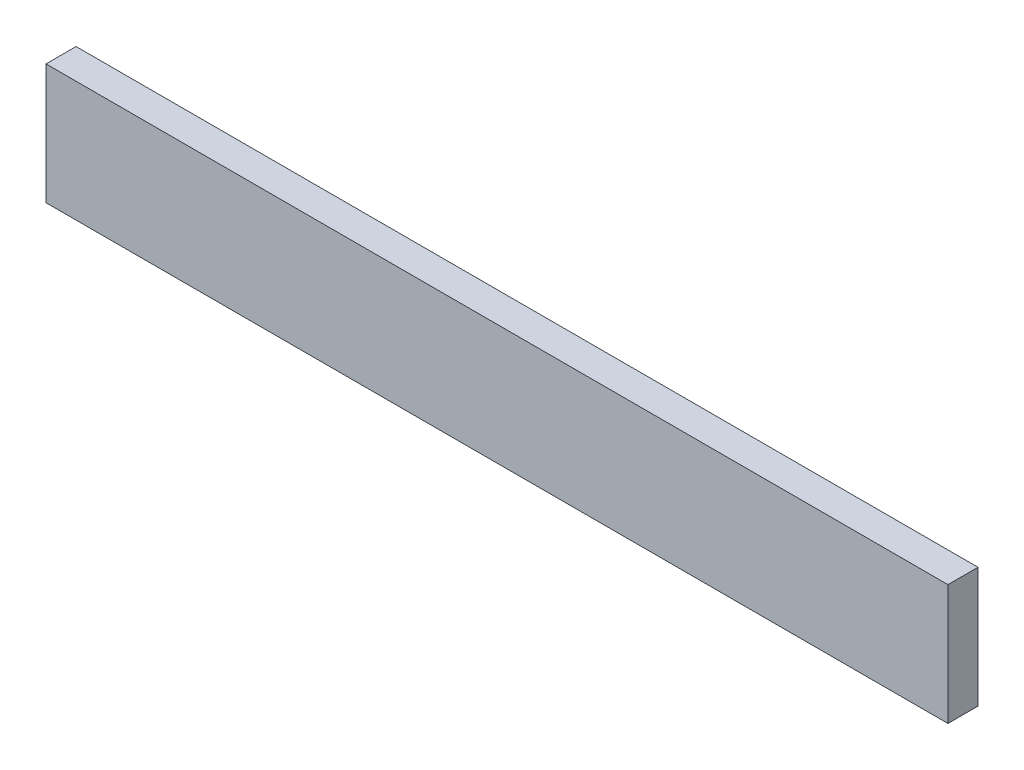
ISO-10303-21;
HEADER;
FILE_DESCRIPTION(('STEP AP214'),'2;1');
FILE_NAME('part.step','',(''),(''),'','','');
FILE_SCHEMA(('AUTOMOTIVE_DESIGN { 1 0 10303 214 1 1 1 1 }'));
ENDSEC;
DATA;
#1=APPLICATION_CONTEXT('core data for automotive mechanical design processes');
#2=APPLICATION_PROTOCOL_DEFINITION('international standard','automotive_design',2000,#1);
#3=PRODUCT_CONTEXT('',#1,'mechanical');
#4=PRODUCT('Part','Part','',(#3));
#5=PRODUCT_RELATED_PRODUCT_CATEGORY('part','',(#4));
#6=PRODUCT_DEFINITION_FORMATION('','',#4);
#7=PRODUCT_DEFINITION_CONTEXT('part definition',#1,'design');
#8=PRODUCT_DEFINITION('design','',#6,#7);
#9=PRODUCT_DEFINITION_SHAPE('','',#8);
#10=(LENGTH_UNIT() NAMED_UNIT(*) SI_UNIT(.MILLI.,.METRE.));
#11=(NAMED_UNIT(*) PLANE_ANGLE_UNIT() SI_UNIT($,.RADIAN.));
#12=(NAMED_UNIT(*) SI_UNIT($,.STERADIAN.) SOLID_ANGLE_UNIT());
#13=UNCERTAINTY_MEASURE_WITH_UNIT(LENGTH_MEASURE(1.E-05),#10,'distance_accuracy_value','');
#14=(GEOMETRIC_REPRESENTATION_CONTEXT(3) GLOBAL_UNCERTAINTY_ASSIGNED_CONTEXT((#13)) GLOBAL_UNIT_ASSIGNED_CONTEXT((#10,
#11,#12)) REPRESENTATION_CONTEXT('',''));
#15=CARTESIAN_POINT('',(0.,0.,0.));
#16=DIRECTION('',(0.,0.,1.));
#17=DIRECTION('',(1.,0.,0.));
#18=AXIS2_PLACEMENT_3D('',#15,#16,#17);
#19=CARTESIAN_POINT('',(74.5,345.,-302.5));
#20=DIRECTION('',(0.,0.,1.));
#21=DIRECTION('',(1.,0.,0.));
#22=AXIS2_PLACEMENT_3D('',#19,#20,#21);
#23=PLANE('',#22);
#24=DIRECTION('',(-1.,0.,0.));
#25=VECTOR('',#24,1.);
#26=CARTESIAN_POINT('',(74.5,325.,-302.5));
#27=LINE('',#26,#25);
#28=CARTESIAN_POINT('',(74.5,325.,-302.5));
#29=VERTEX_POINT('',#28);
#30=CARTESIAN_POINT('',(-75.5,325.,-302.5));
#31=VERTEX_POINT('',#30);
#32=EDGE_CURVE('E61',#29,#31,#27,.T.);
#33=ORIENTED_EDGE('',*,*,#32,.T.);
#34=DIRECTION('',(0.,-1.,0.));
#35=VECTOR('',#34,1.);
#36=CARTESIAN_POINT('',(-75.5,345.,-302.5));
#37=LINE('',#36,#35);
#38=CARTESIAN_POINT('',(-75.5,345.,-302.5));
#39=VERTEX_POINT('',#38);
#40=EDGE_CURVE('E11',#39,#31,#37,.T.);
#41=ORIENTED_EDGE('',*,*,#40,.F.);
#42=DIRECTION('',(-1.,0.,0.));
#43=VECTOR('',#42,1.);
#44=CARTESIAN_POINT('',(74.5,345.,-302.5));
#45=LINE('',#44,#43);
#46=CARTESIAN_POINT('',(74.5,345.,-302.5));
#47=VERTEX_POINT('',#46);
#48=EDGE_CURVE('E80',#47,#39,#45,.T.);
#49=ORIENTED_EDGE('',*,*,#48,.F.);
#50=DIRECTION('',(0.,-1.,0.));
#51=VECTOR('',#50,1.);
#52=CARTESIAN_POINT('',(74.5,345.,-302.5));
#53=LINE('',#52,#51);
#54=EDGE_CURVE('E73',#47,#29,#53,.T.);
#55=ORIENTED_EDGE('',*,*,#54,.T.);
#56=EDGE_LOOP('',(#33,#41,#49,#55));
#57=FACE_BOUND('',#56,.T.);
#58=ADVANCED_FACE('F17',(#57),#23,.F.);
#59=CARTESIAN_POINT('',(-75.5,345.,-302.5));
#60=DIRECTION('',(1.,0.,0.));
#61=DIRECTION('',(0.,0.,-1.));
#62=AXIS2_PLACEMENT_3D('',#59,#60,#61);
#63=PLANE('',#62);
#64=DIRECTION('',(0.,0.,1.));
#65=VECTOR('',#64,1.);
#66=CARTESIAN_POINT('',(-75.5,325.,-302.5));
#67=LINE('',#66,#65);
#68=CARTESIAN_POINT('',(-75.5,325.,-297.5));
#69=VERTEX_POINT('',#68);
#70=EDGE_CURVE('E57',#31,#69,#67,.T.);
#71=ORIENTED_EDGE('',*,*,#70,.T.);
#72=DIRECTION('',(0.,-1.,0.));
#73=VECTOR('',#72,1.);
#74=CARTESIAN_POINT('',(-75.5,345.,-297.5));
#75=LINE('',#74,#73);
#76=CARTESIAN_POINT('',(-75.5,345.,-297.5));
#77=VERTEX_POINT('',#76);
#78=EDGE_CURVE('E24',#77,#69,#75,.T.);
#79=ORIENTED_EDGE('',*,*,#78,.F.);
#80=DIRECTION('',(0.,0.,1.));
#81=VECTOR('',#80,1.);
#82=CARTESIAN_POINT('',(-75.5,345.,-302.5));
#83=LINE('',#82,#81);
#84=EDGE_CURVE('E69',#39,#77,#83,.T.);
#85=ORIENTED_EDGE('',*,*,#84,.F.);
#86=ORIENTED_EDGE('',*,*,#40,.T.);
#87=EDGE_LOOP('',(#71,#79,#85,#86));
#88=FACE_BOUND('',#87,.T.);
#89=ADVANCED_FACE('F68',(#88),#63,.F.);
#90=CARTESIAN_POINT('',(-75.5,345.,-297.5));
#91=DIRECTION('',(0.,0.,-1.));
#92=DIRECTION('',(-1.,0.,0.));
#93=AXIS2_PLACEMENT_3D('',#90,#91,#92);
#94=PLANE('',#93);
#95=DIRECTION('',(1.,0.,0.));
#96=VECTOR('',#95,1.);
#97=CARTESIAN_POINT('',(-75.5,325.,-297.5));
#98=LINE('',#97,#96);
#99=CARTESIAN_POINT('',(74.5,325.,-297.5));
#100=VERTEX_POINT('',#99);
#101=EDGE_CURVE('E62',#69,#100,#98,.T.);
#102=ORIENTED_EDGE('',*,*,#101,.T.);
#103=DIRECTION('',(0.,-1.,0.));
#104=VECTOR('',#103,1.);
#105=CARTESIAN_POINT('',(74.5,345.,-297.5));
#106=LINE('',#105,#104);
#107=CARTESIAN_POINT('',(74.5,345.,-297.5));
#108=VERTEX_POINT('',#107);
#109=EDGE_CURVE('E85',#108,#100,#106,.T.);
#110=ORIENTED_EDGE('',*,*,#109,.F.);
#111=DIRECTION('',(1.,0.,0.));
#112=VECTOR('',#111,1.);
#113=CARTESIAN_POINT('',(-75.5,345.,-297.5));
#114=LINE('',#113,#112);
#115=EDGE_CURVE('E36',#77,#108,#114,.T.);
#116=ORIENTED_EDGE('',*,*,#115,.F.);
#117=ORIENTED_EDGE('',*,*,#78,.T.);
#118=EDGE_LOOP('',(#102,#110,#116,#117));
#119=FACE_BOUND('',#118,.T.);
#120=ADVANCED_FACE('F88',(#119),#94,.F.);
#121=CARTESIAN_POINT('',(74.5,345.,-297.5));
#122=DIRECTION('',(-1.,0.,0.));
#123=DIRECTION('',(0.,0.,1.));
#124=AXIS2_PLACEMENT_3D('',#121,#122,#123);
#125=PLANE('',#124);
#126=DIRECTION('',(0.,0.,-1.));
#127=VECTOR('',#126,1.);
#128=CARTESIAN_POINT('',(74.5,325.,-297.5));
#129=LINE('',#128,#127);
#130=EDGE_CURVE('E77',#100,#29,#129,.T.);
#131=ORIENTED_EDGE('',*,*,#130,.T.);
#132=ORIENTED_EDGE('',*,*,#54,.F.);
#133=DIRECTION('',(0.,0.,-1.));
#134=VECTOR('',#133,1.);
#135=CARTESIAN_POINT('',(74.5,345.,-297.5));
#136=LINE('',#135,#134);
#137=EDGE_CURVE('E31',#108,#47,#136,.T.);
#138=ORIENTED_EDGE('',*,*,#137,.F.);
#139=ORIENTED_EDGE('',*,*,#109,.T.);
#140=EDGE_LOOP('',(#131,#132,#138,#139));
#141=FACE_BOUND('',#140,.T.);
#142=ADVANCED_FACE('F90',(#141),#125,.F.);
#143=CARTESIAN_POINT('',(-75.5,345.,-302.5));
#144=DIRECTION('',(0.,1.,0.));
#145=DIRECTION('',(-1.,0.,0.));
#146=AXIS2_PLACEMENT_3D('',#143,#144,#145);
#147=PLANE('',#146);
#148=ORIENTED_EDGE('',*,*,#48,.T.);
#149=ORIENTED_EDGE('',*,*,#84,.T.);
#150=ORIENTED_EDGE('',*,*,#115,.T.);
#151=ORIENTED_EDGE('',*,*,#137,.T.);
#152=EDGE_LOOP('',(#148,#149,#150,#151));
#153=FACE_BOUND('',#152,.T.);
#154=ADVANCED_FACE('F91',(#153),#147,.T.);
#155=CARTESIAN_POINT('',(-75.5,325.,-302.5));
#156=DIRECTION('',(0.,1.,0.));
#157=DIRECTION('',(-1.,0.,0.));
#158=AXIS2_PLACEMENT_3D('',#155,#156,#157);
#159=PLANE('',#158);
#160=ORIENTED_EDGE('',*,*,#32,.F.);
#161=ORIENTED_EDGE('',*,*,#130,.F.);
#162=ORIENTED_EDGE('',*,*,#101,.F.);
#163=ORIENTED_EDGE('',*,*,#70,.F.);
#164=EDGE_LOOP('',(#160,#161,#162,#163));
#165=FACE_BOUND('',#164,.T.);
#166=ADVANCED_FACE('F58',(#165),#159,.F.);
#167=CLOSED_SHELL('',(#58,#89,#120,#142,#154,#166));
#168=MANIFOLD_SOLID_BREP('B1',#167);
#169=ADVANCED_BREP_SHAPE_REPRESENTATION('',(#18,#168),#14);
#170=SHAPE_DEFINITION_REPRESENTATION(#9,#169);
ENDSEC;
END-ISO-10303-21;
